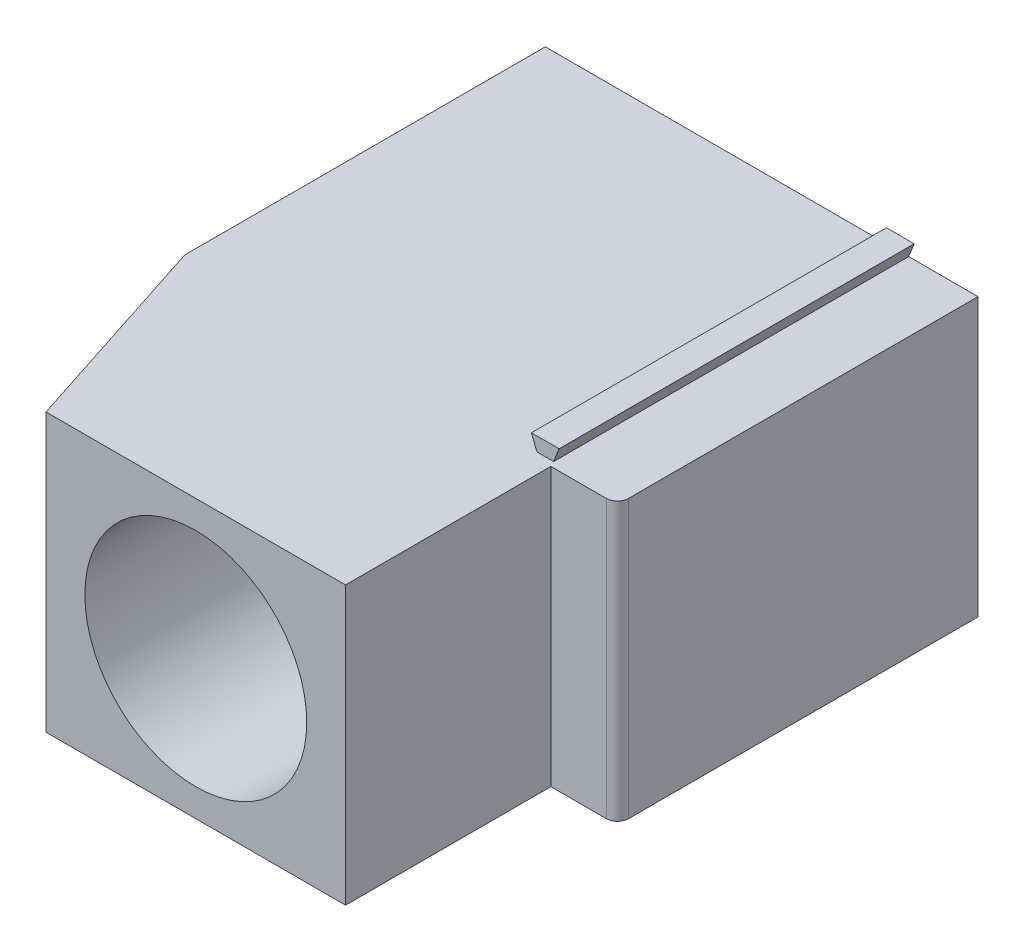
ISO-10303-21;
HEADER;
FILE_DESCRIPTION(('STEP AP214'),'2;1');
FILE_NAME('part.step','',(''),(''),'','','');
FILE_SCHEMA(('AUTOMOTIVE_DESIGN { 1 0 10303 214 1 1 1 1 }'));
ENDSEC;
DATA;
#1=APPLICATION_CONTEXT('core data for automotive mechanical design processes');
#2=APPLICATION_PROTOCOL_DEFINITION('international standard','automotive_design',2000,#1);
#3=PRODUCT_CONTEXT('',#1,'mechanical');
#4=PRODUCT('Part','Part','',(#3));
#5=PRODUCT_RELATED_PRODUCT_CATEGORY('part','',(#4));
#6=PRODUCT_DEFINITION_FORMATION('','',#4);
#7=PRODUCT_DEFINITION_CONTEXT('part definition',#1,'design');
#8=PRODUCT_DEFINITION('design','',#6,#7);
#9=PRODUCT_DEFINITION_SHAPE('','',#8);
#10=(LENGTH_UNIT() NAMED_UNIT(*) SI_UNIT(.MILLI.,.METRE.));
#11=(NAMED_UNIT(*) PLANE_ANGLE_UNIT() SI_UNIT($,.RADIAN.));
#12=(NAMED_UNIT(*) SI_UNIT($,.STERADIAN.) SOLID_ANGLE_UNIT());
#13=UNCERTAINTY_MEASURE_WITH_UNIT(LENGTH_MEASURE(1.E-05),#10,'distance_accuracy_value','');
#14=(GEOMETRIC_REPRESENTATION_CONTEXT(3) GLOBAL_UNCERTAINTY_ASSIGNED_CONTEXT((#13)) GLOBAL_UNIT_ASSIGNED_CONTEXT((#10,
#11,#12)) REPRESENTATION_CONTEXT('',''));
#15=CARTESIAN_POINT('',(0.,0.,0.));
#16=DIRECTION('',(0.,0.,1.));
#17=DIRECTION('',(1.,0.,0.));
#18=AXIS2_PLACEMENT_3D('',#15,#16,#17);
#19=CARTESIAN_POINT('',(-2.5,0.5,5.3));
#20=DIRECTION('',(0.,0.,1.));
#21=DIRECTION('',(1.,0.,0.));
#22=AXIS2_PLACEMENT_3D('',#19,#20,#21);
#23=PLANE('',#22);
#24=DIRECTION('',(0.,1.,0.));
#25=VECTOR('',#24,1.);
#26=CARTESIAN_POINT('',(-2.5,0.5,5.3));
#27=LINE('',#26,#25);
#28=CARTESIAN_POINT('',(-2.5,3.92828568570856,5.3));
#29=VERTEX_POINT('',#28);
#30=CARTESIAN_POINT('',(-2.5,4.5,5.3));
#31=VERTEX_POINT('',#30);
#32=EDGE_CURVE('E283',#29,#31,#27,.T.);
#33=ORIENTED_EDGE('',*,*,#32,.F.);
#34=CARTESIAN_POINT('',(-3.9,2.5,5.3));
#35=DIRECTION('',(0.,0.,1.));
#36=DIRECTION('',(1.,0.,0.));
#37=AXIS2_PLACEMENT_3D('',#34,#35,#36);
#38=CIRCLE('',#37,1.99999999999999);
#39=CARTESIAN_POINT('',(-3.9,4.5,5.3));
#40=VERTEX_POINT('',#39);
#41=EDGE_CURVE('E201',#29,#40,#38,.T.);
#42=ORIENTED_EDGE('',*,*,#41,.T.);
#43=DIRECTION('',(-1.,0.,0.));
#44=VECTOR('',#43,1.);
#45=CARTESIAN_POINT('',(-2.5,4.5,5.3));
#46=LINE('',#45,#44);
#47=EDGE_CURVE('E293',#31,#40,#46,.T.);
#48=ORIENTED_EDGE('',*,*,#47,.F.);
#49=EDGE_LOOP('',(#33,#42,#48));
#50=FACE_BOUND('',#49,.T.);
#51=ADVANCED_FACE('F34',(#50),#23,.F.);
#52=CARTESIAN_POINT('',(-6.8,4.5,5.3));
#53=VERTEX_POINT('',#52);
#54=EDGE_CURVE('E297',#40,#53,#46,.T.);
#55=ORIENTED_EDGE('',*,*,#54,.F.);
#56=CARTESIAN_POINT('',(-3.9,0.500000000000005,5.3));
#57=VERTEX_POINT('',#56);
#58=EDGE_CURVE('E469',#40,#57,#38,.T.);
#59=ORIENTED_EDGE('',*,*,#58,.T.);
#60=DIRECTION('',(-1.,0.,0.));
#61=VECTOR('',#60,1.);
#62=CARTESIAN_POINT('',(-2.5,0.5,5.3));
#63=LINE('',#62,#61);
#64=CARTESIAN_POINT('',(-6.8,0.5,5.3));
#65=VERTEX_POINT('',#64);
#66=EDGE_CURVE('E292',#57,#65,#63,.T.);
#67=ORIENTED_EDGE('',*,*,#66,.T.);
#68=DIRECTION('',(0.,-1.,0.));
#69=VECTOR('',#68,1.);
#70=CARTESIAN_POINT('',(-6.8,4.5,5.3));
#71=LINE('',#70,#69);
#72=EDGE_CURVE('E310',#53,#65,#71,.T.);
#73=ORIENTED_EDGE('',*,*,#72,.F.);
#74=EDGE_LOOP('',(#55,#59,#67,#73));
#75=FACE_BOUND('',#74,.T.);
#76=ADVANCED_FACE('F439',(#75),#23,.F.);
#77=CARTESIAN_POINT('',(-7.8,0.5,0.));
#78=DIRECTION('',(-1.,0.,0.));
#79=DIRECTION('',(0.,0.,1.));
#80=AXIS2_PLACEMENT_3D('',#77,#78,#79);
#81=PLANE('',#80);
#82=DIRECTION('',(0.,0.,-1.));
#83=VECTOR('',#82,1.);
#84=CARTESIAN_POINT('',(-7.8,0.,0.));
#85=LINE('',#84,#83);
#86=CARTESIAN_POINT('',(-7.8,0.,6.50000000000004));
#87=VERTEX_POINT('',#86);
#88=CARTESIAN_POINT('',(-7.8,0.,0.));
#89=VERTEX_POINT('',#88);
#90=EDGE_CURVE('E269',#87,#89,#85,.T.);
#91=ORIENTED_EDGE('',*,*,#90,.F.);
#92=DIRECTION('',(0.,1.,0.));
#93=VECTOR('',#92,1.);
#94=CARTESIAN_POINT('',(-7.8,0.5,6.50000000000004));
#95=LINE('',#94,#93);
#96=CARTESIAN_POINT('',(-7.8,5.,6.50000000000005));
#97=VERTEX_POINT('',#96);
#98=EDGE_CURVE('E216',#87,#97,#95,.T.);
#99=ORIENTED_EDGE('',*,*,#98,.T.);
#100=DIRECTION('',(0.,0.,1.));
#101=VECTOR('',#100,1.);
#102=CARTESIAN_POINT('',(-7.8,5.,0.));
#103=LINE('',#102,#101);
#104=CARTESIAN_POINT('',(-7.8,5.,0.));
#105=VERTEX_POINT('',#104);
#106=EDGE_CURVE('E422',#105,#97,#103,.T.);
#107=ORIENTED_EDGE('',*,*,#106,.F.);
#108=DIRECTION('',(0.,1.,0.));
#109=VECTOR('',#108,1.);
#110=CARTESIAN_POINT('',(-7.8,0.5,0.));
#111=LINE('',#110,#109);
#112=CARTESIAN_POINT('',(-7.8,2.9,0.));
#113=VERTEX_POINT('',#112);
#114=EDGE_CURVE('E223',#113,#105,#111,.T.);
#115=ORIENTED_EDGE('',*,*,#114,.F.);
#116=DIRECTION('',(0.,0.,-1.));
#117=VECTOR('',#116,1.);
#118=CARTESIAN_POINT('',(-7.8,2.9,10.201));
#119=LINE('',#118,#117);
#120=CARTESIAN_POINT('',(-7.8,2.9,0.8));
#121=VERTEX_POINT('',#120);
#122=EDGE_CURVE('E375',#121,#113,#119,.T.);
#123=ORIENTED_EDGE('',*,*,#122,.F.);
#124=DIRECTION('',(0.,-1.,0.));
#125=VECTOR('',#124,1.);
#126=CARTESIAN_POINT('',(-7.8,4.5,0.8));
#127=LINE('',#126,#125);
#128=CARTESIAN_POINT('',(-7.8,4.5,0.8));
#129=VERTEX_POINT('',#128);
#130=EDGE_CURVE('E327',#129,#121,#127,.T.);
#131=ORIENTED_EDGE('',*,*,#130,.F.);
#132=DIRECTION('',(0.,0.,-1.));
#133=VECTOR('',#132,1.);
#134=CARTESIAN_POINT('',(-7.8,4.5,6.3));
#135=LINE('',#134,#133);
#136=CARTESIAN_POINT('',(-7.8,4.5,6.3));
#137=VERTEX_POINT('',#136);
#138=EDGE_CURVE('E307',#137,#129,#135,.T.);
#139=ORIENTED_EDGE('',*,*,#138,.F.);
#140=DIRECTION('',(0.,-1.,0.));
#141=VECTOR('',#140,1.);
#142=CARTESIAN_POINT('',(-7.8,4.5,6.3));
#143=LINE('',#142,#141);
#144=CARTESIAN_POINT('',(-7.8,0.499999999999999,6.3));
#145=VERTEX_POINT('',#144);
#146=EDGE_CURVE('E320',#137,#145,#143,.T.);
#147=ORIENTED_EDGE('',*,*,#146,.T.);
#148=DIRECTION('',(0.,0.,-1.));
#149=VECTOR('',#148,1.);
#150=CARTESIAN_POINT('',(-7.8,0.5,0.));
#151=LINE('',#150,#149);
#152=CARTESIAN_POINT('',(-7.8,0.499999999999999,0.8));
#153=VERTEX_POINT('',#152);
#154=EDGE_CURVE('E263',#145,#153,#151,.T.);
#155=ORIENTED_EDGE('',*,*,#154,.T.);
#156=CARTESIAN_POINT('',(-7.8,2.1,0.8));
#157=VERTEX_POINT('',#156);
#158=EDGE_CURVE('E323',#157,#153,#127,.T.);
#159=ORIENTED_EDGE('',*,*,#158,.F.);
#160=DIRECTION('',(0.,0.,-1.));
#161=VECTOR('',#160,1.);
#162=CARTESIAN_POINT('',(-7.8,2.1,10.201));
#163=LINE('',#162,#161);
#164=CARTESIAN_POINT('',(-7.8,2.1,0.));
#165=VERTEX_POINT('',#164);
#166=EDGE_CURVE('E372',#157,#165,#163,.T.);
#167=ORIENTED_EDGE('',*,*,#166,.T.);
#168=EDGE_CURVE('E217',#89,#165,#111,.T.);
#169=ORIENTED_EDGE('',*,*,#168,.F.);
#170=EDGE_LOOP('',(#91,#99,#107,#115,#123,#131,#139,#147,#155,#159,#167,#169));
#171=FACE_BOUND('',#170,.T.);
#172=ADVANCED_FACE('F396',(#171),#81,.T.);
#173=CARTESIAN_POINT('',(0.,0.5,0.));
#174=DIRECTION('',(0.,0.,-1.));
#175=DIRECTION('',(-1.,0.,0.));
#176=AXIS2_PLACEMENT_3D('',#173,#174,#175);
#177=PLANE('',#176);
#178=DIRECTION('',(-1.,0.,0.));
#179=VECTOR('',#178,1.);
#180=CARTESIAN_POINT('',(-3.71823341,2.1,0.));
#181=LINE('',#180,#179);
#182=CARTESIAN_POINT('',(-3.71823341,2.1,0.));
#183=VERTEX_POINT('',#182);
#184=EDGE_CURVE('E365',#183,#165,#181,.T.);
#185=ORIENTED_EDGE('',*,*,#184,.F.);
#186=CARTESIAN_POINT('',(-3.71823341,2.5,0.));
#187=DIRECTION('',(0.,0.,-1.));
#188=DIRECTION('',(-1.,0.,0.));
#189=AXIS2_PLACEMENT_3D('',#186,#187,#188);
#190=CIRCLE('',#189,0.4);
#191=CARTESIAN_POINT('',(-3.71823341,2.9,0.));
#192=VERTEX_POINT('',#191);
#193=EDGE_CURVE('E370',#192,#183,#190,.T.);
#194=ORIENTED_EDGE('',*,*,#193,.F.);
#195=DIRECTION('',(1.,0.,0.));
#196=VECTOR('',#195,1.);
#197=CARTESIAN_POINT('',(-7.8,2.9,0.));
#198=LINE('',#197,#196);
#199=EDGE_CURVE('E367',#113,#192,#198,.T.);
#200=ORIENTED_EDGE('',*,*,#199,.F.);
#201=ORIENTED_EDGE('',*,*,#114,.T.);
#202=DIRECTION('',(-1.,0.,0.));
#203=VECTOR('',#202,1.);
#204=CARTESIAN_POINT('',(0.,5.,0.));
#205=LINE('',#204,#203);
#206=CARTESIAN_POINT('',(-1.55,5.,0.));
#207=VERTEX_POINT('',#206);
#208=EDGE_CURVE('E413',#207,#105,#205,.T.);
#209=ORIENTED_EDGE('',*,*,#208,.F.);
#210=DIRECTION('',(-0.371390676354102,0.92847669088526,0.));
#211=VECTOR('',#210,1.);
#212=CARTESIAN_POINT('',(0.215517241379303,0.58620689655172,0.));
#213=LINE('',#212,#211);
#214=CARTESIAN_POINT('',(-1.65,5.25,0.));
#215=VERTEX_POINT('',#214);
#216=EDGE_CURVE('E331',#215,#207,#213,.F.);
#217=ORIENTED_EDGE('',*,*,#216,.F.);
#218=DIRECTION('',(-1.,0.,0.));
#219=VECTOR('',#218,1.);
#220=CARTESIAN_POINT('',(-1.55,5.25,0.));
#221=LINE('',#220,#219);
#222=CARTESIAN_POINT('',(-1.15,5.25,0.));
#223=VERTEX_POINT('',#222);
#224=EDGE_CURVE('E334',#223,#215,#221,.T.);
#225=ORIENTED_EDGE('',*,*,#224,.F.);
#226=DIRECTION('',(0.371390676354102,0.92847669088526,0.));
#227=VECTOR('',#226,1.);
#228=CARTESIAN_POINT('',(-1.25,5.,0.));
#229=LINE('',#228,#227);
#230=CARTESIAN_POINT('',(-1.25,5.,0.));
#231=VERTEX_POINT('',#230);
#232=EDGE_CURVE('E226',#223,#231,#229,.F.);
#233=ORIENTED_EDGE('',*,*,#232,.T.);
#234=CARTESIAN_POINT('',(0.,5.,0.));
#235=VERTEX_POINT('',#234);
#236=EDGE_CURVE('E409',#235,#231,#205,.T.);
#237=ORIENTED_EDGE('',*,*,#236,.F.);
#238=DIRECTION('',(0.,1.,0.));
#239=VECTOR('',#238,1.);
#240=CARTESIAN_POINT('',(0.,0.5,0.));
#241=LINE('',#240,#239);
#242=CARTESIAN_POINT('',(0.,0.,0.));
#243=VERTEX_POINT('',#242);
#244=EDGE_CURVE('E406',#243,#235,#241,.T.);
#245=ORIENTED_EDGE('',*,*,#244,.F.);
#246=DIRECTION('',(1.,0.,0.));
#247=VECTOR('',#246,1.);
#248=CARTESIAN_POINT('',(0.,0.,0.));
#249=LINE('',#248,#247);
#250=EDGE_CURVE('E271',#89,#243,#249,.T.);
#251=ORIENTED_EDGE('',*,*,#250,.F.);
#252=ORIENTED_EDGE('',*,*,#168,.T.);
#253=EDGE_LOOP('',(#185,#194,#200,#201,#209,#217,#225,#233,#237,#245,#251,#252));
#254=FACE_BOUND('',#253,.T.);
#255=ADVANCED_FACE('F403',(#254),#177,.T.);
#256=CARTESIAN_POINT('',(0.,0.5,10.2));
#257=DIRECTION('',(1.,0.,0.));
#258=DIRECTION('',(0.,0.,-1.));
#259=AXIS2_PLACEMENT_3D('',#256,#257,#258);
#260=PLANE('',#259);
#261=DIRECTION('',(0.,0.,-1.));
#262=VECTOR('',#261,1.);
#263=CARTESIAN_POINT('',(0.,5.,10.2));
#264=LINE('',#263,#262);
#265=CARTESIAN_POINT('',(0.,5.,6.3));
#266=VERTEX_POINT('',#265);
#267=EDGE_CURVE('E408',#266,#235,#264,.T.);
#268=ORIENTED_EDGE('',*,*,#267,.F.);
#269=DIRECTION('',(0.,1.,0.));
#270=VECTOR('',#269,1.);
#271=CARTESIAN_POINT('',(0.,0.,6.3));
#272=LINE('',#271,#270);
#273=CARTESIAN_POINT('',(0.,0.,6.3));
#274=VERTEX_POINT('',#273);
#275=EDGE_CURVE('E42',#266,#274,#272,.F.);
#276=ORIENTED_EDGE('',*,*,#275,.T.);
#277=DIRECTION('',(0.,0.,1.));
#278=VECTOR('',#277,1.);
#279=CARTESIAN_POINT('',(0.,0.,10.2));
#280=LINE('',#279,#278);
#281=EDGE_CURVE('E274',#243,#274,#280,.T.);
#282=ORIENTED_EDGE('',*,*,#281,.F.);
#283=ORIENTED_EDGE('',*,*,#244,.T.);
#284=EDGE_LOOP('',(#268,#276,#282,#283));
#285=FACE_BOUND('',#284,.T.);
#286=ADVANCED_FACE('F407',(#285),#260,.T.);
#287=CARTESIAN_POINT('',(-7.8,0.5,10.2));
#288=DIRECTION('',(0.,0.,1.));
#289=DIRECTION('',(1.,0.,0.));
#290=AXIS2_PLACEMENT_3D('',#287,#288,#289);
#291=PLANE('',#290);
#292=CARTESIAN_POINT('',(-3.9,2.5,10.2));
#293=DIRECTION('',(0.,0.,1.));
#294=DIRECTION('',(1.,0.,0.));
#295=AXIS2_PLACEMENT_3D('',#292,#293,#294);
#296=CIRCLE('',#295,1.99999999999999);
#297=CARTESIAN_POINT('',(-1.90000000000001,2.5,10.2));
#298=VERTEX_POINT('',#297);
#299=EDGE_CURVE('E211',#298,#298,#296,.T.);
#300=ORIENTED_EDGE('',*,*,#299,.F.);
#301=EDGE_LOOP('',(#300));
#302=FACE_BOUND('',#301,.T.);
#303=DIRECTION('',(1.,0.,0.));
#304=VECTOR('',#303,1.);
#305=CARTESIAN_POINT('',(-7.8,5.,10.2));
#306=LINE('',#305,#304);
#307=CARTESIAN_POINT('',(-6.59999999999999,5.,10.2));
#308=VERTEX_POINT('',#307);
#309=CARTESIAN_POINT('',(-1.2,5.,10.2));
#310=VERTEX_POINT('',#309);
#311=EDGE_CURVE('E389',#308,#310,#306,.T.);
#312=ORIENTED_EDGE('',*,*,#311,.F.);
#313=DIRECTION('',(0.,-1.,0.));
#314=VECTOR('',#313,1.);
#315=CARTESIAN_POINT('',(-6.59999999999999,0.5,10.2));
#316=LINE('',#315,#314);
#317=CARTESIAN_POINT('',(-6.59999999999999,0.,10.2));
#318=VERTEX_POINT('',#317);
#319=EDGE_CURVE('E230',#308,#318,#316,.T.);
#320=ORIENTED_EDGE('',*,*,#319,.T.);
#321=DIRECTION('',(-1.,0.,0.));
#322=VECTOR('',#321,1.);
#323=CARTESIAN_POINT('',(-7.8,0.,10.2));
#324=LINE('',#323,#322);
#325=CARTESIAN_POINT('',(-1.2,0.,10.2));
#326=VERTEX_POINT('',#325);
#327=EDGE_CURVE('E266',#326,#318,#324,.T.);
#328=ORIENTED_EDGE('',*,*,#327,.F.);
#329=DIRECTION('',(0.,1.,0.));
#330=VECTOR('',#329,1.);
#331=CARTESIAN_POINT('',(-1.2,0.,10.2));
#332=LINE('',#331,#330);
#333=EDGE_CURVE('E260',#326,#310,#332,.T.);
#334=ORIENTED_EDGE('',*,*,#333,.T.);
#335=EDGE_LOOP('',(#312,#320,#328,#334));
#336=FACE_BOUND('',#335,.T.);
#337=ADVANCED_FACE('F387',(#302,#336),#291,.T.);
#338=CARTESIAN_POINT('',(0.,5.,0.));
#339=DIRECTION('',(0.,1.,0.));
#340=DIRECTION('',(0.,0.,1.));
#341=AXIS2_PLACEMENT_3D('',#338,#339,#340);
#342=PLANE('',#341);
#343=DIRECTION('',(-1.,0.,0.));
#344=VECTOR('',#343,1.);
#345=CARTESIAN_POINT('',(0.,5.,6.5));
#346=LINE('',#345,#344);
#347=CARTESIAN_POINT('',(-0.2,5.,6.5));
#348=VERTEX_POINT('',#347);
#349=CARTESIAN_POINT('',(-1.2,5.,6.5));
#350=VERTEX_POINT('',#349);
#351=EDGE_CURVE('E242',#348,#350,#346,.T.);
#352=ORIENTED_EDGE('',*,*,#351,.F.);
#353=CARTESIAN_POINT('',(-0.2,5.,6.3));
#354=DIRECTION('',(0.,1.,0.));
#355=DIRECTION('',(0.,0.,1.));
#356=AXIS2_PLACEMENT_3D('',#353,#354,#355);
#357=CIRCLE('',#356,0.2);
#358=EDGE_CURVE('E56',#348,#266,#357,.T.);
#359=ORIENTED_EDGE('',*,*,#358,.T.);
#360=ORIENTED_EDGE('',*,*,#267,.T.);
#361=ORIENTED_EDGE('',*,*,#236,.T.);
#362=DIRECTION('',(0.,0.,-1.));
#363=VECTOR('',#362,1.);
#364=CARTESIAN_POINT('',(-1.25,5.,0.));
#365=LINE('',#364,#363);
#366=CARTESIAN_POINT('',(-1.25,5.,6.4));
#367=VERTEX_POINT('',#366);
#368=EDGE_CURVE('E339',#367,#231,#365,.T.);
#369=ORIENTED_EDGE('',*,*,#368,.F.);
#370=DIRECTION('',(1.,0.,0.));
#371=VECTOR('',#370,1.);
#372=CARTESIAN_POINT('',(-1.25,5.,6.4));
#373=LINE('',#372,#371);
#374=CARTESIAN_POINT('',(-1.55,5.,6.4));
#375=VERTEX_POINT('',#374);
#376=EDGE_CURVE('E330',#375,#367,#373,.T.);
#377=ORIENTED_EDGE('',*,*,#376,.F.);
#378=DIRECTION('',(0.,0.,1.));
#379=VECTOR('',#378,1.);
#380=CARTESIAN_POINT('',(-1.55,5.,6.4));
#381=LINE('',#380,#379);
#382=EDGE_CURVE('E205',#207,#375,#381,.T.);
#383=ORIENTED_EDGE('',*,*,#382,.F.);
#384=ORIENTED_EDGE('',*,*,#208,.T.);
#385=ORIENTED_EDGE('',*,*,#106,.T.);
#386=DIRECTION('',(-0.308504698037441,0.,-0.951222818948761));
#387=VECTOR('',#386,1.);
#388=CARTESIAN_POINT('',(-8.96510244547259,5.,2.90760079312629));
#389=LINE('',#388,#387);
#390=EDGE_CURVE('E220',#97,#308,#389,.F.);
#391=ORIENTED_EDGE('',*,*,#390,.T.);
#392=ORIENTED_EDGE('',*,*,#311,.T.);
#393=DIRECTION('',(0.,0.,1.));
#394=VECTOR('',#393,1.);
#395=CARTESIAN_POINT('',(-1.2,5.,6.5));
#396=LINE('',#395,#394);
#397=EDGE_CURVE('E250',#350,#310,#396,.T.);
#398=ORIENTED_EDGE('',*,*,#397,.F.);
#399=EDGE_LOOP('',(#352,#359,#360,#361,#369,#377,#383,#384,#385,#391,#392,#398));
#400=FACE_BOUND('',#399,.T.);
#401=ADVANCED_FACE('F248',(#400),#342,.T.);
#402=CARTESIAN_POINT('',(-7.8,4.5,0.8));
#403=DIRECTION('',(0.,0.,-1.));
#404=DIRECTION('',(-1.,0.,0.));
#405=AXIS2_PLACEMENT_3D('',#402,#403,#404);
#406=PLANE('',#405);
#407=CARTESIAN_POINT('',(-3.71823341,2.5,0.8));
#408=DIRECTION('',(0.,0.,-1.));
#409=DIRECTION('',(-1.,0.,0.));
#410=AXIS2_PLACEMENT_3D('',#407,#408,#409);
#411=CIRCLE('',#410,0.4);
#412=CARTESIAN_POINT('',(-3.71823341,2.1,0.8));
#413=VERTEX_POINT('',#412);
#414=CARTESIAN_POINT('',(-3.71823341,2.9,0.800000000000001));
#415=VERTEX_POINT('',#414);
#416=EDGE_CURVE('E360',#413,#415,#411,.F.);
#417=ORIENTED_EDGE('',*,*,#416,.F.);
#418=DIRECTION('',(1.,0.,0.));
#419=VECTOR('',#418,1.);
#420=CARTESIAN_POINT('',(-3.71823341,2.1,0.8));
#421=LINE('',#420,#419);
#422=EDGE_CURVE('E362',#157,#413,#421,.T.);
#423=ORIENTED_EDGE('',*,*,#422,.F.);
#424=ORIENTED_EDGE('',*,*,#158,.T.);
#425=DIRECTION('',(1.,0.,0.));
#426=VECTOR('',#425,1.);
#427=CARTESIAN_POINT('',(-7.8,0.499999999999999,0.8));
#428=LINE('',#427,#426);
#429=CARTESIAN_POINT('',(-2.5,0.5,0.8));
#430=VERTEX_POINT('',#429);
#431=EDGE_CURVE('E296',#153,#430,#428,.T.);
#432=ORIENTED_EDGE('',*,*,#431,.T.);
#433=DIRECTION('',(0.,-1.,0.));
#434=VECTOR('',#433,1.);
#435=CARTESIAN_POINT('',(-2.5,4.5,0.8));
#436=LINE('',#435,#434);
#437=CARTESIAN_POINT('',(-2.5,4.5,0.8));
#438=VERTEX_POINT('',#437);
#439=EDGE_CURVE('E289',#438,#430,#436,.T.);
#440=ORIENTED_EDGE('',*,*,#439,.F.);
#441=DIRECTION('',(1.,0.,0.));
#442=VECTOR('',#441,1.);
#443=CARTESIAN_POINT('',(-7.8,4.5,0.8));
#444=LINE('',#443,#442);
#445=EDGE_CURVE('E301',#129,#438,#444,.T.);
#446=ORIENTED_EDGE('',*,*,#445,.F.);
#447=ORIENTED_EDGE('',*,*,#130,.T.);
#448=DIRECTION('',(-1.,0.,0.));
#449=VECTOR('',#448,1.);
#450=CARTESIAN_POINT('',(-7.8,2.9,0.8));
#451=LINE('',#450,#449);
#452=EDGE_CURVE('E343',#415,#121,#451,.T.);
#453=ORIENTED_EDGE('',*,*,#452,.F.);
#454=EDGE_LOOP('',(#417,#423,#424,#432,#440,#446,#447,#453));
#455=FACE_BOUND('',#454,.T.);
#456=ADVANCED_FACE('F481',(#455),#406,.F.);
#457=CARTESIAN_POINT('',(-6.8,4.5,5.3));
#458=DIRECTION('',(0.707106781186548,0.,0.707106781186548));
#459=DIRECTION('',(0.707106781186548,0.,-0.707106781186548));
#460=AXIS2_PLACEMENT_3D('',#457,#458,#459);
#461=PLANE('',#460);
#462=DIRECTION('',(-0.707106781186548,0.,0.707106781186548));
#463=VECTOR('',#462,1.);
#464=CARTESIAN_POINT('',(-6.8,0.499999999999999,5.3));
#465=LINE('',#464,#463);
#466=EDGE_CURVE('E304',#65,#145,#465,.T.);
#467=ORIENTED_EDGE('',*,*,#466,.T.);
#468=ORIENTED_EDGE('',*,*,#146,.F.);
#469=DIRECTION('',(-0.707106781186548,0.,0.707106781186548));
#470=VECTOR('',#469,1.);
#471=CARTESIAN_POINT('',(-6.8,4.5,5.3));
#472=LINE('',#471,#470);
#473=EDGE_CURVE('E303',#53,#137,#472,.T.);
#474=ORIENTED_EDGE('',*,*,#473,.F.);
#475=ORIENTED_EDGE('',*,*,#72,.T.);
#476=EDGE_LOOP('',(#467,#468,#474,#475));
#477=FACE_BOUND('',#476,.T.);
#478=ADVANCED_FACE('F456',(#477),#461,.F.);
#479=CARTESIAN_POINT('',(0.,4.5,0.));
#480=DIRECTION('',(0.,-1.,0.));
#481=DIRECTION('',(0.,0.,-1.));
#482=AXIS2_PLACEMENT_3D('',#479,#480,#481);
#483=PLANE('',#482);
#484=ORIENTED_EDGE('',*,*,#47,.T.);
#485=ORIENTED_EDGE('',*,*,#54,.T.);
#486=ORIENTED_EDGE('',*,*,#473,.T.);
#487=ORIENTED_EDGE('',*,*,#138,.T.);
#488=ORIENTED_EDGE('',*,*,#445,.T.);
#489=DIRECTION('',(0.,0.,-1.));
#490=VECTOR('',#489,1.);
#491=CARTESIAN_POINT('',(-2.5,4.5,5.3));
#492=LINE('',#491,#490);
#493=EDGE_CURVE('E286',#31,#438,#492,.T.);
#494=ORIENTED_EDGE('',*,*,#493,.F.);
#495=EDGE_LOOP('',(#484,#485,#486,#487,#488,#494));
#496=FACE_BOUND('',#495,.T.);
#497=ADVANCED_FACE('F450',(#496),#483,.T.);
#498=CARTESIAN_POINT('',(-2.5,0.5,5.3));
#499=VERTEX_POINT('',#498);
#500=EDGE_CURVE('E298',#499,#57,#63,.T.);
#501=ORIENTED_EDGE('',*,*,#500,.T.);
#502=CARTESIAN_POINT('',(-2.5,1.07171431429144,5.3));
#503=VERTEX_POINT('',#502);
#504=EDGE_CURVE('E210',#57,#503,#38,.T.);
#505=ORIENTED_EDGE('',*,*,#504,.T.);
#506=EDGE_CURVE('E284',#499,#503,#27,.T.);
#507=ORIENTED_EDGE('',*,*,#506,.F.);
#508=EDGE_LOOP('',(#501,#505,#507));
#509=FACE_BOUND('',#508,.T.);
#510=ADVANCED_FACE('F442',(#509),#23,.F.);
#511=CARTESIAN_POINT('',(-2.5,0.,0.));
#512=DIRECTION('',(-1.,0.,0.));
#513=DIRECTION('',(0.,0.,1.));
#514=AXIS2_PLACEMENT_3D('',#511,#512,#513);
#515=PLANE('',#514);
#516=DIRECTION('',(0.,0.,1.));
#517=VECTOR('',#516,1.);
#518=CARTESIAN_POINT('',(-2.5,1.07171431429144,10.2));
#519=LINE('',#518,#517);
#520=CARTESIAN_POINT('',(-2.5,1.07171431429145,4.5));
#521=VERTEX_POINT('',#520);
#522=EDGE_CURVE('E215',#521,#503,#519,.T.);
#523=ORIENTED_EDGE('',*,*,#522,.F.);
#524=DIRECTION('',(0.,-1.,0.));
#525=VECTOR('',#524,1.);
#526=CARTESIAN_POINT('',(-2.5,0.,4.5));
#527=LINE('',#526,#525);
#528=CARTESIAN_POINT('',(-2.5,3.92828568570856,4.5));
#529=VERTEX_POINT('',#528);
#530=EDGE_CURVE('E209',#529,#521,#527,.T.);
#531=ORIENTED_EDGE('',*,*,#530,.F.);
#532=DIRECTION('',(0.,0.,1.));
#533=VECTOR('',#532,1.);
#534=CARTESIAN_POINT('',(-2.5,3.92828568570856,10.2));
#535=LINE('',#534,#533);
#536=EDGE_CURVE('E194',#29,#529,#535,.F.);
#537=ORIENTED_EDGE('',*,*,#536,.F.);
#538=ORIENTED_EDGE('',*,*,#32,.T.);
#539=ORIENTED_EDGE('',*,*,#493,.T.);
#540=ORIENTED_EDGE('',*,*,#439,.T.);
#541=DIRECTION('',(0.,0.,1.));
#542=VECTOR('',#541,1.);
#543=CARTESIAN_POINT('',(-2.5,0.5,0.8));
#544=LINE('',#543,#542);
#545=EDGE_CURVE('E276',#430,#499,#544,.T.);
#546=ORIENTED_EDGE('',*,*,#545,.T.);
#547=ORIENTED_EDGE('',*,*,#506,.T.);
#548=EDGE_LOOP('',(#523,#531,#537,#538,#539,#540,#546,#547));
#549=FACE_BOUND('',#548,.T.);
#550=ADVANCED_FACE('F213',(#549),#515,.T.);
#551=CARTESIAN_POINT('',(0.,0.5,0.));
#552=DIRECTION('',(0.,1.,0.));
#553=DIRECTION('',(0.,0.,1.));
#554=AXIS2_PLACEMENT_3D('',#551,#552,#553);
#555=PLANE('',#554);
#556=ORIENTED_EDGE('',*,*,#66,.F.);
#557=ORIENTED_EDGE('',*,*,#500,.F.);
#558=ORIENTED_EDGE('',*,*,#545,.F.);
#559=ORIENTED_EDGE('',*,*,#431,.F.);
#560=ORIENTED_EDGE('',*,*,#154,.F.);
#561=ORIENTED_EDGE('',*,*,#466,.F.);
#562=EDGE_LOOP('',(#556,#557,#558,#559,#560,#561));
#563=FACE_BOUND('',#562,.T.);
#564=ADVANCED_FACE('F435',(#563),#555,.T.);
#565=CARTESIAN_POINT('',(0.,0.,0.));
#566=DIRECTION('',(0.,1.,0.));
#567=DIRECTION('',(0.,0.,1.));
#568=AXIS2_PLACEMENT_3D('',#565,#566,#567);
#569=PLANE('',#568);
#570=ORIENTED_EDGE('',*,*,#281,.T.);
#571=CARTESIAN_POINT('',(-0.2,0.,6.3));
#572=DIRECTION('',(0.,1.,0.));
#573=DIRECTION('',(0.,0.,1.));
#574=AXIS2_PLACEMENT_3D('',#571,#572,#573);
#575=CIRCLE('',#574,0.2);
#576=CARTESIAN_POINT('',(-0.2,0.,6.5));
#577=VERTEX_POINT('',#576);
#578=EDGE_CURVE('E11',#274,#577,#575,.F.);
#579=ORIENTED_EDGE('',*,*,#578,.T.);
#580=DIRECTION('',(-1.,0.,0.));
#581=VECTOR('',#580,1.);
#582=CARTESIAN_POINT('',(0.,0.,6.5));
#583=LINE('',#582,#581);
#584=CARTESIAN_POINT('',(-1.2,0.,6.5));
#585=VERTEX_POINT('',#584);
#586=EDGE_CURVE('E244',#577,#585,#583,.T.);
#587=ORIENTED_EDGE('',*,*,#586,.T.);
#588=DIRECTION('',(0.,0.,1.));
#589=VECTOR('',#588,1.);
#590=CARTESIAN_POINT('',(-1.2,0.,6.5));
#591=LINE('',#590,#589);
#592=EDGE_CURVE('E257',#585,#326,#591,.T.);
#593=ORIENTED_EDGE('',*,*,#592,.T.);
#594=ORIENTED_EDGE('',*,*,#327,.T.);
#595=DIRECTION('',(0.308504698037441,0.,0.951222818948761));
#596=VECTOR('',#595,1.);
#597=CARTESIAN_POINT('',(-7.8,0.,6.50000000000004));
#598=LINE('',#597,#596);
#599=EDGE_CURVE('E232',#318,#87,#598,.F.);
#600=ORIENTED_EDGE('',*,*,#599,.T.);
#601=ORIENTED_EDGE('',*,*,#90,.T.);
#602=ORIENTED_EDGE('',*,*,#250,.T.);
#603=EDGE_LOOP('',(#570,#579,#587,#593,#594,#600,#601,#602));
#604=FACE_BOUND('',#603,.T.);
#605=ADVANCED_FACE('F382',(#604),#569,.F.);
#606=CARTESIAN_POINT('',(-1.2,0.,6.5));
#607=DIRECTION('',(-1.,0.,0.));
#608=DIRECTION('',(0.,0.,1.));
#609=AXIS2_PLACEMENT_3D('',#606,#607,#608);
#610=PLANE('',#609);
#611=ORIENTED_EDGE('',*,*,#397,.T.);
#612=ORIENTED_EDGE('',*,*,#333,.F.);
#613=ORIENTED_EDGE('',*,*,#592,.F.);
#614=DIRECTION('',(0.,1.,0.));
#615=VECTOR('',#614,1.);
#616=CARTESIAN_POINT('',(-1.2,0.,6.5));
#617=LINE('',#616,#615);
#618=EDGE_CURVE('E264',#585,#350,#617,.T.);
#619=ORIENTED_EDGE('',*,*,#618,.T.);
#620=EDGE_LOOP('',(#611,#612,#613,#619));
#621=FACE_BOUND('',#620,.T.);
#622=ADVANCED_FACE('F426',(#621),#610,.F.);
#623=CARTESIAN_POINT('',(0.,0.,6.5));
#624=DIRECTION('',(0.,0.,-1.));
#625=DIRECTION('',(-1.,0.,0.));
#626=AXIS2_PLACEMENT_3D('',#623,#624,#625);
#627=PLANE('',#626);
#628=ORIENTED_EDGE('',*,*,#586,.F.);
#629=DIRECTION('',(0.,1.,0.));
#630=VECTOR('',#629,1.);
#631=CARTESIAN_POINT('',(-0.2,5.,6.5));
#632=LINE('',#631,#630);
#633=EDGE_CURVE('E234',#577,#348,#632,.T.);
#634=ORIENTED_EDGE('',*,*,#633,.T.);
#635=ORIENTED_EDGE('',*,*,#351,.T.);
#636=ORIENTED_EDGE('',*,*,#618,.F.);
#637=EDGE_LOOP('',(#628,#634,#635,#636));
#638=FACE_BOUND('',#637,.T.);
#639=ADVANCED_FACE('F240',(#638),#627,.F.);
#640=CARTESIAN_POINT('',(-3.71823341,2.1,10.201));
#641=DIRECTION('',(0.,-1.,0.));
#642=DIRECTION('',(0.,0.,-1.));
#643=AXIS2_PLACEMENT_3D('',#640,#641,#642);
#644=PLANE('',#643);
#645=ORIENTED_EDGE('',*,*,#422,.T.);
#646=DIRECTION('',(0.,0.,-1.));
#647=VECTOR('',#646,1.);
#648=CARTESIAN_POINT('',(-3.71823341,2.1,10.201));
#649=LINE('',#648,#647);
#650=EDGE_CURVE('E251',#413,#183,#649,.T.);
#651=ORIENTED_EDGE('',*,*,#650,.T.);
#652=ORIENTED_EDGE('',*,*,#184,.T.);
#653=ORIENTED_EDGE('',*,*,#166,.F.);
#654=EDGE_LOOP('',(#645,#651,#652,#653));
#655=FACE_BOUND('',#654,.T.);
#656=ADVANCED_FACE('F433',(#655),#644,.F.);
#657=CARTESIAN_POINT('',(-3.71823341,2.5,10.201));
#658=DIRECTION('',(0.,0.,-1.));
#659=DIRECTION('',(-1.,0.,0.));
#660=AXIS2_PLACEMENT_3D('',#657,#658,#659);
#661=CYLINDRICAL_SURFACE('',#660,0.4);
#662=ORIENTED_EDGE('',*,*,#416,.T.);
#663=DIRECTION('',(0.,0.,-1.));
#664=VECTOR('',#663,1.);
#665=CARTESIAN_POINT('',(-3.71823341,2.9,10.201));
#666=LINE('',#665,#664);
#667=EDGE_CURVE('E254',#415,#192,#666,.T.);
#668=ORIENTED_EDGE('',*,*,#667,.T.);
#669=ORIENTED_EDGE('',*,*,#193,.T.);
#670=ORIENTED_EDGE('',*,*,#650,.F.);
#671=EDGE_LOOP('',(#662,#668,#669,#670));
#672=FACE_BOUND('',#671,.T.);
#673=ADVANCED_FACE('F514',(#672),#661,.F.);
#674=CARTESIAN_POINT('',(-7.8,2.9,10.201));
#675=DIRECTION('',(0.,1.,0.));
#676=DIRECTION('',(-1.,0.,0.));
#677=AXIS2_PLACEMENT_3D('',#674,#675,#676);
#678=PLANE('',#677);
#679=ORIENTED_EDGE('',*,*,#452,.T.);
#680=ORIENTED_EDGE('',*,*,#122,.T.);
#681=ORIENTED_EDGE('',*,*,#199,.T.);
#682=ORIENTED_EDGE('',*,*,#667,.F.);
#683=EDGE_LOOP('',(#679,#680,#681,#682));
#684=FACE_BOUND('',#683,.T.);
#685=ADVANCED_FACE('F492',(#684),#678,.F.);
#686=CARTESIAN_POINT('',(-1.55,5.,6.4));
#687=DIRECTION('',(-0.92847669088526,-0.371390676354102,0.));
#688=DIRECTION('',(0.371390676354102,-0.92847669088526,0.));
#689=AXIS2_PLACEMENT_3D('',#686,#687,#688);
#690=PLANE('',#689);
#691=ORIENTED_EDGE('',*,*,#382,.T.);
#692=DIRECTION('',(-0.371390676354102,0.92847669088526,0.));
#693=VECTOR('',#692,1.);
#694=CARTESIAN_POINT('',(-1.5948275862069,5.11206896551724,6.4));
#695=LINE('',#694,#693);
#696=CARTESIAN_POINT('',(-1.65,5.25,6.4));
#697=VERTEX_POINT('',#696);
#698=EDGE_CURVE('E340',#697,#375,#695,.F.);
#699=ORIENTED_EDGE('',*,*,#698,.F.);
#700=DIRECTION('',(0.,0.,-1.));
#701=VECTOR('',#700,1.);
#702=CARTESIAN_POINT('',(-1.65,5.25,0.));
#703=LINE('',#702,#701);
#704=EDGE_CURVE('E335',#215,#697,#703,.F.);
#705=ORIENTED_EDGE('',*,*,#704,.F.);
#706=ORIENTED_EDGE('',*,*,#216,.T.);
#707=EDGE_LOOP('',(#691,#699,#705,#706));
#708=FACE_BOUND('',#707,.T.);
#709=ADVANCED_FACE('F488',(#708),#690,.T.);
#710=CARTESIAN_POINT('',(-1.25,5.25,6.4));
#711=DIRECTION('',(0.,0.,-1.));
#712=DIRECTION('',(0.,1.,0.));
#713=AXIS2_PLACEMENT_3D('',#710,#711,#712);
#714=PLANE('',#713);
#715=ORIENTED_EDGE('',*,*,#376,.T.);
#716=DIRECTION('',(0.371390676354102,0.92847669088526,0.));
#717=VECTOR('',#716,1.);
#718=CARTESIAN_POINT('',(-1.25,5.,6.4));
#719=LINE('',#718,#717);
#720=CARTESIAN_POINT('',(-1.15,5.25,6.4));
#721=VERTEX_POINT('',#720);
#722=EDGE_CURVE('E344',#721,#367,#719,.F.);
#723=ORIENTED_EDGE('',*,*,#722,.F.);
#724=DIRECTION('',(1.,0.,0.));
#725=VECTOR('',#724,1.);
#726=CARTESIAN_POINT('',(-1.25,5.25,6.4));
#727=LINE('',#726,#725);
#728=EDGE_CURVE('E338',#697,#721,#727,.T.);
#729=ORIENTED_EDGE('',*,*,#728,.F.);
#730=ORIENTED_EDGE('',*,*,#698,.T.);
#731=EDGE_LOOP('',(#715,#723,#729,#730));
#732=FACE_BOUND('',#731,.T.);
#733=ADVANCED_FACE('F491',(#732),#714,.F.);
#734=CARTESIAN_POINT('',(-1.25,5.,0.));
#735=DIRECTION('',(0.92847669088526,-0.371390676354102,0.));
#736=DIRECTION('',(0.371390676354102,0.92847669088526,0.));
#737=AXIS2_PLACEMENT_3D('',#734,#735,#736);
#738=PLANE('',#737);
#739=ORIENTED_EDGE('',*,*,#368,.T.);
#740=ORIENTED_EDGE('',*,*,#232,.F.);
#741=DIRECTION('',(0.,0.,1.));
#742=VECTOR('',#741,1.);
#743=CARTESIAN_POINT('',(-1.15,5.25,0.));
#744=LINE('',#743,#742);
#745=EDGE_CURVE('E346',#721,#223,#744,.F.);
#746=ORIENTED_EDGE('',*,*,#745,.F.);
#747=ORIENTED_EDGE('',*,*,#722,.T.);
#748=EDGE_LOOP('',(#739,#740,#746,#747));
#749=FACE_BOUND('',#748,.T.);
#750=ADVANCED_FACE('F494',(#749),#738,.T.);
#751=CARTESIAN_POINT('',(0.,5.25,0.));
#752=DIRECTION('',(0.,-1.,0.));
#753=DIRECTION('',(0.,0.,-1.));
#754=AXIS2_PLACEMENT_3D('',#751,#752,#753);
#755=PLANE('',#754);
#756=ORIENTED_EDGE('',*,*,#704,.T.);
#757=ORIENTED_EDGE('',*,*,#728,.T.);
#758=ORIENTED_EDGE('',*,*,#745,.T.);
#759=ORIENTED_EDGE('',*,*,#224,.T.);
#760=EDGE_LOOP('',(#756,#757,#758,#759));
#761=FACE_BOUND('',#760,.T.);
#762=ADVANCED_FACE('F496',(#761),#755,.F.);
#763=CARTESIAN_POINT('',(-3.9,2.5,4.5));
#764=DIRECTION('',(0.,0.,-1.));
#765=DIRECTION('',(-1.,0.,0.));
#766=AXIS2_PLACEMENT_3D('',#763,#764,#765);
#767=PLANE('',#766);
#768=ORIENTED_EDGE('',*,*,#530,.T.);
#769=CARTESIAN_POINT('',(-3.9,2.5,4.5));
#770=DIRECTION('',(0.,0.,1.));
#771=DIRECTION('',(1.,0.,0.));
#772=AXIS2_PLACEMENT_3D('',#769,#770,#771);
#773=CIRCLE('',#772,1.99999999999999);
#774=EDGE_CURVE('E198',#521,#529,#773,.T.);
#775=ORIENTED_EDGE('',*,*,#774,.T.);
#776=EDGE_LOOP('',(#768,#775));
#777=FACE_BOUND('',#776,.T.);
#778=ADVANCED_FACE('F208',(#777),#767,.F.);
#779=CARTESIAN_POINT('',(-3.9,2.5,10.2));
#780=DIRECTION('',(0.,0.,1.));
#781=DIRECTION('',(1.,0.,0.));
#782=AXIS2_PLACEMENT_3D('',#779,#780,#781);
#783=CYLINDRICAL_SURFACE('',#782,1.99999999999999);
#784=ORIENTED_EDGE('',*,*,#536,.T.);
#785=ORIENTED_EDGE('',*,*,#774,.F.);
#786=ORIENTED_EDGE('',*,*,#522,.T.);
#787=ORIENTED_EDGE('',*,*,#504,.F.);
#788=ORIENTED_EDGE('',*,*,#58,.F.);
#789=ORIENTED_EDGE('',*,*,#41,.F.);
#790=EDGE_LOOP('',(#784,#785,#786,#787,#788,#789));
#791=FACE_BOUND('',#790,.T.);
#792=ORIENTED_EDGE('',*,*,#299,.T.);
#793=EDGE_LOOP('',(#792));
#794=FACE_BOUND('',#793,.T.);
#795=ADVANCED_FACE('F196',(#791,#794),#783,.F.);
#796=CARTESIAN_POINT('',(-7.8,0.5,6.50000000000004));
#797=DIRECTION('',(0.951222818948761,0.,-0.308504698037441));
#798=DIRECTION('',(0.,1.,0.));
#799=AXIS2_PLACEMENT_3D('',#796,#797,#798);
#800=PLANE('',#799);
#801=ORIENTED_EDGE('',*,*,#599,.F.);
#802=ORIENTED_EDGE('',*,*,#319,.F.);
#803=ORIENTED_EDGE('',*,*,#390,.F.);
#804=ORIENTED_EDGE('',*,*,#98,.F.);
#805=EDGE_LOOP('',(#801,#802,#803,#804));
#806=FACE_BOUND('',#805,.T.);
#807=ADVANCED_FACE('F391',(#806),#800,.F.);
#808=CARTESIAN_POINT('',(-0.2,0.,6.3));
#809=DIRECTION('',(0.,-1.,0.));
#810=DIRECTION('',(0.,0.,-1.));
#811=AXIS2_PLACEMENT_3D('',#808,#809,#810);
#812=CYLINDRICAL_SURFACE('',#811,0.2);
#813=ORIENTED_EDGE('',*,*,#578,.F.);
#814=ORIENTED_EDGE('',*,*,#275,.F.);
#815=ORIENTED_EDGE('',*,*,#358,.F.);
#816=ORIENTED_EDGE('',*,*,#633,.F.);
#817=EDGE_LOOP('',(#813,#814,#815,#816));
#818=FACE_BOUND('',#817,.T.);
#819=ADVANCED_FACE('F36',(#818),#812,.T.);
#820=CLOSED_SHELL('',(#51,#76,#172,#255,#286,#337,#401,#456,#478,#497,#510,#550,#564,#605,#622,
#639,#656,#673,#685,#709,#733,#750,#762,#778,#795,#807,#819));
#821=MANIFOLD_SOLID_BREP('B2',#820);
#822=ADVANCED_BREP_SHAPE_REPRESENTATION('',(#18,#821),#14);
#823=SHAPE_DEFINITION_REPRESENTATION(#9,#822);
ENDSEC;
END-ISO-10303-21;
